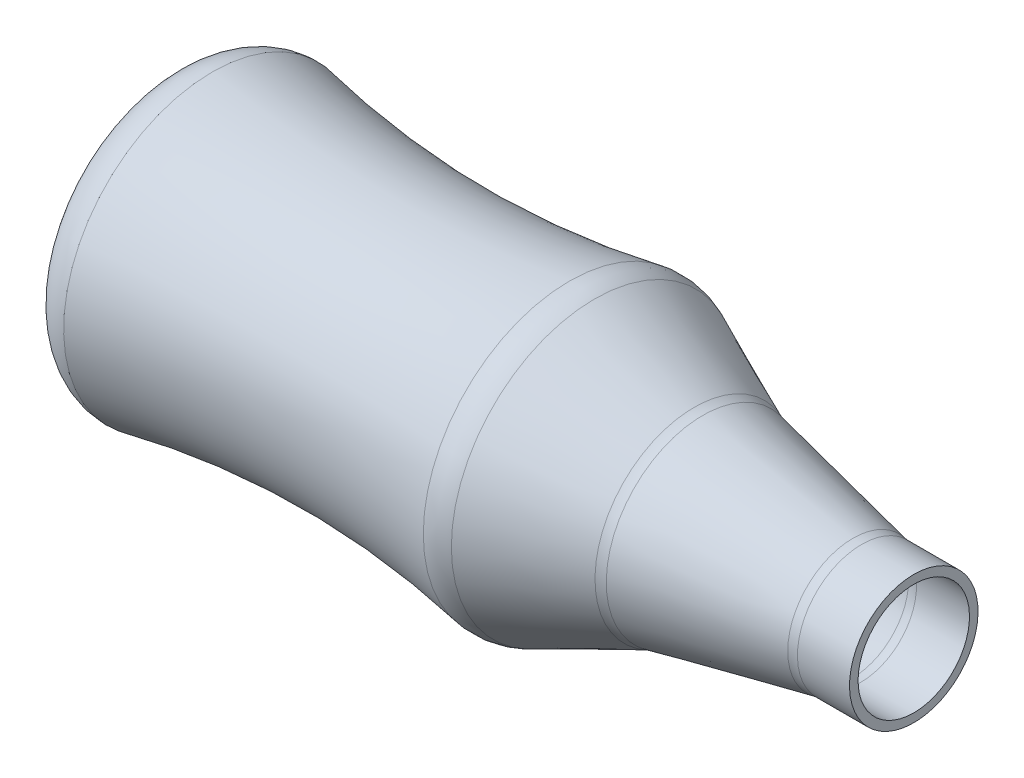
ISO-10303-21;
HEADER;
FILE_DESCRIPTION(('STEP AP214'),'2;1');
FILE_NAME('part.step','',(''),(''),'','','');
FILE_SCHEMA(('AUTOMOTIVE_DESIGN { 1 0 10303 214 1 1 1 1 }'));
ENDSEC;
DATA;
#1=APPLICATION_CONTEXT('core data for automotive mechanical design processes');
#2=APPLICATION_PROTOCOL_DEFINITION('international standard','automotive_design',2000,#1);
#3=PRODUCT_CONTEXT('',#1,'mechanical');
#4=PRODUCT('Part','Part','',(#3));
#5=PRODUCT_RELATED_PRODUCT_CATEGORY('part','',(#4));
#6=PRODUCT_DEFINITION_FORMATION('','',#4);
#7=PRODUCT_DEFINITION_CONTEXT('part definition',#1,'design');
#8=PRODUCT_DEFINITION('design','',#6,#7);
#9=PRODUCT_DEFINITION_SHAPE('','',#8);
#10=(LENGTH_UNIT() NAMED_UNIT(*) SI_UNIT(.MILLI.,.METRE.));
#11=(NAMED_UNIT(*) PLANE_ANGLE_UNIT() SI_UNIT($,.RADIAN.));
#12=(NAMED_UNIT(*) SI_UNIT($,.STERADIAN.) SOLID_ANGLE_UNIT());
#13=UNCERTAINTY_MEASURE_WITH_UNIT(LENGTH_MEASURE(1.E-05),#10,'distance_accuracy_value','');
#14=(GEOMETRIC_REPRESENTATION_CONTEXT(3) GLOBAL_UNCERTAINTY_ASSIGNED_CONTEXT((#13)) GLOBAL_UNIT_ASSIGNED_CONTEXT((#10,
#11,#12)) REPRESENTATION_CONTEXT('',''));
#15=CARTESIAN_POINT('',(0.,0.,0.));
#16=DIRECTION('',(0.,0.,1.));
#17=DIRECTION('',(1.,0.,0.));
#18=AXIS2_PLACEMENT_3D('',#15,#16,#17);
#19=CARTESIAN_POINT('',(0.,0.,0.));
#20=DIRECTION('',(-1.,0.,0.));
#21=DIRECTION('',(0.,-1.,0.));
#22=AXIS2_PLACEMENT_3D('',#19,#20,#21);
#23=PLANE('',#22);
#24=CARTESIAN_POINT('',(0.,0.,0.));
#25=DIRECTION('',(-1.,0.,0.));
#26=DIRECTION('',(0.,-1.,0.));
#27=AXIS2_PLACEMENT_3D('',#24,#25,#26);
#28=CIRCLE('',#27,13.);
#29=CARTESIAN_POINT('',(0.,-13.,0.));
#30=VERTEX_POINT('',#29);
#31=EDGE_CURVE('E76',#30,#30,#28,.F.);
#32=ORIENTED_EDGE('',*,*,#31,.F.);
#33=EDGE_LOOP('',(#32));
#34=FACE_BOUND('',#33,.T.);
#35=CARTESIAN_POINT('',(0.,0.,0.));
#36=DIRECTION('',(1.,0.,0.));
#37=DIRECTION('',(0.,1.,0.));
#38=AXIS2_PLACEMENT_3D('',#35,#36,#37);
#39=CIRCLE('',#38,15.);
#40=CARTESIAN_POINT('',(0.,15.,0.));
#41=VERTEX_POINT('',#40);
#42=EDGE_CURVE('E67',#41,#41,#39,.T.);
#43=ORIENTED_EDGE('',*,*,#42,.T.);
#44=EDGE_LOOP('',(#43));
#45=FACE_BOUND('',#44,.T.);
#46=ADVANCED_FACE('F35',(#34,#45),#23,.F.);
#47=CARTESIAN_POINT('',(0.,0.,0.));
#48=DIRECTION('',(1.,0.,0.));
#49=DIRECTION('',(0.,1.,0.));
#50=AXIS2_PLACEMENT_3D('',#47,#48,#49);
#51=CYLINDRICAL_SURFACE('',#50,15.);
#52=CARTESIAN_POINT('',(-12.1564053171412,0.,0.));
#53=DIRECTION('',(1.,0.,0.));
#54=DIRECTION('',(0.,1.,0.));
#55=AXIS2_PLACEMENT_3D('',#52,#53,#54);
#56=CIRCLE('',#55,15.);
#57=CARTESIAN_POINT('',(-12.1564053171412,15.,0.));
#58=VERTEX_POINT('',#57);
#59=EDGE_CURVE('E50',#58,#58,#56,.T.);
#60=ORIENTED_EDGE('',*,*,#59,.T.);
#61=EDGE_LOOP('',(#60));
#62=FACE_BOUND('',#61,.T.);
#63=ORIENTED_EDGE('',*,*,#42,.F.);
#64=EDGE_LOOP('',(#63));
#65=FACE_BOUND('',#64,.T.);
#66=ADVANCED_FACE('F111',(#62,#65),#51,.T.);
#67=CARTESIAN_POINT('',(-50.28,0.,0.));
#68=DIRECTION('',(-1.,0.,0.));
#69=DIRECTION('',(0.,-1.,0.));
#70=AXIS2_PLACEMENT_3D('',#67,#68,#69);
#71=CONICAL_SURFACE('',#70,22.75,0.205987480927103);
#72=CARTESIAN_POINT('',(-49.2503154175611,0.,0.));
#73=DIRECTION('',(-1.,0.,0.));
#74=DIRECTION('',(0.,-1.,0.));
#75=AXIS2_PLACEMENT_3D('',#72,#73,#74);
#76=CIRCLE('',#75,22.5348461711);
#77=CARTESIAN_POINT('',(-49.2503154175611,-22.5348461711,0.));
#78=VERTEX_POINT('',#77);
#79=EDGE_CURVE('E61',#78,#78,#76,.F.);
#80=ORIENTED_EDGE('',*,*,#79,.T.);
#81=EDGE_LOOP('',(#80));
#82=FACE_BOUND('',#81,.T.);
#83=CARTESIAN_POINT('',(-14.2017439625941,0.,0.));
#84=DIRECTION('',(-1.,0.,0.));
#85=DIRECTION('',(0.,-1.,0.));
#86=AXIS2_PLACEMENT_3D('',#83,#84,#85);
#87=CIRCLE('',#86,15.2114051148586);
#88=CARTESIAN_POINT('',(-14.2017439625941,-15.2114051148586,0.));
#89=VERTEX_POINT('',#88);
#90=EDGE_CURVE('E64',#89,#89,#87,.T.);
#91=ORIENTED_EDGE('',*,*,#90,.T.);
#92=EDGE_LOOP('',(#91));
#93=FACE_BOUND('',#92,.T.);
#94=ADVANCED_FACE('F117',(#82,#93),#71,.T.);
#95=CARTESIAN_POINT('',(-77.37,0.,0.));
#96=DIRECTION('',(-1.,0.,0.));
#97=DIRECTION('',(0.,-1.,0.));
#98=AXIS2_PLACEMENT_3D('',#95,#96,#97);
#99=CONICAL_SURFACE('',#98,34.705,0.41560114868109);
#100=CARTESIAN_POINT('',(-51.242376556801,0.,0.));
#101=DIRECTION('',(-1.,0.,0.));
#102=DIRECTION('',(0.,-1.,0.));
#103=AXIS2_PLACEMENT_3D('',#100,#101,#102);
#104=CIRCLE('',#103,23.1747032756204);
#105=CARTESIAN_POINT('',(-51.242376556801,-23.1747032756204,0.));
#106=VERTEX_POINT('',#105);
#107=EDGE_CURVE('E55',#106,#106,#104,.T.);
#108=ORIENTED_EDGE('',*,*,#107,.T.);
#109=EDGE_LOOP('',(#108));
#110=FACE_BOUND('',#109,.T.);
#111=CARTESIAN_POINT('',(-74.5089876487827,0.,0.));
#112=DIRECTION('',(1.,0.,0.));
#113=DIRECTION('',(0.,1.,0.));
#114=AXIS2_PLACEMENT_3D('',#111,#112,#113);
#115=CIRCLE('',#114,33.4424159225248);
#116=CARTESIAN_POINT('',(-74.5089876487827,33.4424159225248,0.));
#117=VERTEX_POINT('',#116);
#118=EDGE_CURVE('E58',#117,#117,#115,.T.);
#119=ORIENTED_EDGE('',*,*,#118,.T.);
#120=EDGE_LOOP('',(#119));
#121=FACE_BOUND('',#120,.T.);
#122=ADVANCED_FACE('F137',(#110,#121),#99,.T.);
#123=CARTESIAN_POINT('',(-120.56,0.,0.));
#124=DIRECTION('',(1.,0.,0.));
#125=DIRECTION('',(0.,1.,0.));
#126=AXIS2_PLACEMENT_3D('',#123,#124,#125);
#127=TOROIDAL_SURFACE('',#126,250.423853835264,220.);
#128=CARTESIAN_POINT('',(-80.3730662407156,0.,0.));
#129=DIRECTION('',(-1.,0.,0.));
#130=DIRECTION('',(0.,-1.,0.));
#131=AXIS2_PLACEMENT_3D('',#128,#129,#130);
#132=CIRCLE('',#131,34.1254249111803);
#133=CARTESIAN_POINT('',(-80.3730662407156,-34.1254249111803,0.));
#134=VERTEX_POINT('',#133);
#135=EDGE_CURVE('E46',#134,#134,#132,.T.);
#136=ORIENTED_EDGE('',*,*,#135,.T.);
#137=EDGE_LOOP('',(#136));
#138=FACE_BOUND('',#137,.T.);
#139=CARTESIAN_POINT('',(-163.75,0.,0.));
#140=DIRECTION('',(1.,0.,0.));
#141=DIRECTION('',(0.,1.,0.));
#142=AXIS2_PLACEMENT_3D('',#139,#140,#141);
#143=CIRCLE('',#142,34.705);
#144=CARTESIAN_POINT('',(-163.75,34.705,0.));
#145=VERTEX_POINT('',#144);
#146=EDGE_CURVE('E70',#145,#145,#143,.T.);
#147=ORIENTED_EDGE('',*,*,#146,.T.);
#148=EDGE_LOOP('',(#147));
#149=FACE_BOUND('',#148,.T.);
#150=ADVANCED_FACE('F139',(#138,#149),#127,.F.);
#151=CARTESIAN_POINT('',(-163.75,0.,0.));
#152=DIRECTION('',(1.,0.,0.));
#153=DIRECTION('',(0.,1.,0.));
#154=AXIS2_PLACEMENT_3D('',#151,#152,#153);
#155=TOROIDAL_SURFACE('',#154,24.705,10.);
#156=ORIENTED_EDGE('',*,*,#146,.F.);
#157=EDGE_LOOP('',(#156));
#158=FACE_BOUND('',#157,.T.);
#159=CARTESIAN_POINT('',(-173.75,0.,0.));
#160=DIRECTION('',(1.,0.,0.));
#161=DIRECTION('',(0.,0.,-1.));
#162=AXIS2_PLACEMENT_3D('',#159,#160,#161);
#163=CIRCLE('',#162,24.705);
#164=CARTESIAN_POINT('',(-173.75,0.,-24.705));
#165=VERTEX_POINT('',#164);
#166=EDGE_CURVE('E84',#165,#165,#163,.T.);
#167=ORIENTED_EDGE('',*,*,#166,.T.);
#168=EDGE_LOOP('',(#167));
#169=FACE_BOUND('',#168,.T.);
#170=ADVANCED_FACE('F92',(#158,#169),#155,.T.);
#171=CARTESIAN_POINT('',(0.,0.,0.));
#172=DIRECTION('',(1.,0.,0.));
#173=DIRECTION('',(0.,1.,0.));
#174=AXIS2_PLACEMENT_3D('',#171,#172,#173);
#175=CYLINDRICAL_SURFACE('',#174,13.);
#176=CARTESIAN_POINT('',(-12.363124253713,0.,0.));
#177=DIRECTION('',(-1.,0.,0.));
#178=DIRECTION('',(0.,-1.,0.));
#179=AXIS2_PLACEMENT_3D('',#176,#177,#178);
#180=CIRCLE('',#179,13.);
#181=CARTESIAN_POINT('',(-12.363124253713,-13.,0.));
#182=VERTEX_POINT('',#181);
#183=EDGE_CURVE('E10',#182,#182,#180,.T.);
#184=ORIENTED_EDGE('',*,*,#183,.T.);
#185=EDGE_LOOP('',(#184));
#186=FACE_BOUND('',#185,.T.);
#187=ORIENTED_EDGE('',*,*,#31,.T.);
#188=EDGE_LOOP('',(#187));
#189=FACE_BOUND('',#188,.T.);
#190=ADVANCED_FACE('F152',(#186,#189),#175,.F.);
#191=CARTESIAN_POINT('',(-50.6890677290906,0.,0.));
#192=DIRECTION('',(-1.,0.,0.));
#193=DIRECTION('',(0.,-1.,0.));
#194=AXIS2_PLACEMENT_3D('',#191,#192,#193);
#195=CONICAL_SURFACE('',#194,20.7922810229717,0.205987480927103);
#196=CARTESIAN_POINT('',(-14.4084628991658,0.,0.));
#197=DIRECTION('',(1.,0.,0.));
#198=DIRECTION('',(0.,1.,0.));
#199=AXIS2_PLACEMENT_3D('',#196,#197,#198);
#200=CIRCLE('',#199,13.2114051148586);
#201=CARTESIAN_POINT('',(-14.4084628991658,13.2114051148586,0.));
#202=VERTEX_POINT('',#201);
#203=EDGE_CURVE('E42',#202,#202,#200,.T.);
#204=ORIENTED_EDGE('',*,*,#203,.T.);
#205=EDGE_LOOP('',(#204));
#206=FACE_BOUND('',#205,.T.);
#207=CARTESIAN_POINT('',(-50.8950046455784,0.,0.));
#208=DIRECTION('',(1.,0.,0.));
#209=DIRECTION('',(0.,1.,0.));
#210=AXIS2_PLACEMENT_3D('',#207,#208,#209);
#211=CIRCLE('',#210,20.8353117887517);
#212=CARTESIAN_POINT('',(-50.8950046455784,20.8353117887517,0.));
#213=VERTEX_POINT('',#212);
#214=EDGE_CURVE('E79',#213,#213,#211,.T.);
#215=ORIENTED_EDGE('',*,*,#214,.F.);
#216=EDGE_LOOP('',(#215));
#217=FACE_BOUND('',#216,.T.);
#218=ADVANCED_FACE('F164',(#206,#217),#195,.F.);
#219=CARTESIAN_POINT('',(-78.1774799569386,0.,0.));
#220=DIRECTION('',(-1.,0.,0.));
#221=DIRECTION('',(0.,-1.,0.));
#222=AXIS2_PLACEMENT_3D('',#219,#220,#221);
#223=CONICAL_SURFACE('',#222,32.8752524438758,0.41560114868109);
#224=ORIENTED_EDGE('',*,*,#214,.T.);
#225=EDGE_LOOP('',(#224));
#226=FACE_BOUND('',#225,.T.);
#227=CARTESIAN_POINT('',(-77.5996520345166,0.,0.));
#228=DIRECTION('',(-1.,0.,0.));
#229=DIRECTION('',(0.,-1.,0.));
#230=AXIS2_PLACEMENT_3D('',#227,#228,#229);
#231=CIRCLE('',#230,32.620253078333);
#232=CARTESIAN_POINT('',(-77.5996520345166,-32.620253078333,0.));
#233=VERTEX_POINT('',#232);
#234=EDGE_CURVE('E83',#233,#233,#231,.F.);
#235=ORIENTED_EDGE('',*,*,#234,.F.);
#236=EDGE_LOOP('',(#235));
#237=FACE_BOUND('',#236,.T.);
#238=ADVANCED_FACE('F160',(#226,#237),#223,.F.);
#239=CARTESIAN_POINT('',(-120.56,0.,0.));
#240=DIRECTION('',(1.,0.,0.));
#241=DIRECTION('',(0.,1.,0.));
#242=AXIS2_PLACEMENT_3D('',#239,#240,#241);
#243=TOROIDAL_SURFACE('',#242,250.423853835264,222.);
#244=ORIENTED_EDGE('',*,*,#234,.T.);
#245=EDGE_LOOP('',(#244));
#246=FACE_BOUND('',#245,.T.);
#247=CARTESIAN_POINT('',(-163.936842614778,0.,0.));
#248=DIRECTION('',(-1.,0.,0.));
#249=DIRECTION('',(0.,-1.,0.));
#250=AXIS2_PLACEMENT_3D('',#247,#248,#249);
#251=CIRCLE('',#250,32.7028178172145);
#252=CARTESIAN_POINT('',(-163.936842614778,-32.7028178172145,0.));
#253=VERTEX_POINT('',#252);
#254=EDGE_CURVE('E80',#253,#253,#251,.F.);
#255=ORIENTED_EDGE('',*,*,#254,.F.);
#256=EDGE_LOOP('',(#255));
#257=FACE_BOUND('',#256,.T.);
#258=ADVANCED_FACE('F156',(#246,#257),#243,.T.);
#259=CARTESIAN_POINT('',(-163.75,0.,0.));
#260=DIRECTION('',(1.,0.,0.));
#261=DIRECTION('',(0.,1.,0.));
#262=AXIS2_PLACEMENT_3D('',#259,#260,#261);
#263=TOROIDAL_SURFACE('',#262,24.705,8.00000000000001);
#264=ORIENTED_EDGE('',*,*,#254,.T.);
#265=EDGE_LOOP('',(#264));
#266=FACE_BOUND('',#265,.T.);
#267=CARTESIAN_POINT('',(-171.75,0.,0.));
#268=DIRECTION('',(1.,0.,0.));
#269=DIRECTION('',(0.,1.,0.));
#270=AXIS2_PLACEMENT_3D('',#267,#268,#269);
#271=CIRCLE('',#270,24.705);
#272=CARTESIAN_POINT('',(-171.75,24.705,0.));
#273=VERTEX_POINT('',#272);
#274=EDGE_CURVE('E73',#273,#273,#271,.T.);
#275=ORIENTED_EDGE('',*,*,#274,.F.);
#276=EDGE_LOOP('',(#275));
#277=FACE_BOUND('',#276,.T.);
#278=ADVANCED_FACE('F106',(#266,#277),#263,.F.);
#279=CARTESIAN_POINT('',(-171.75,0.,0.));
#280=DIRECTION('',(1.,0.,0.));
#281=DIRECTION('',(0.,0.,-1.));
#282=AXIS2_PLACEMENT_3D('',#279,#280,#281);
#283=PLANE('',#282);
#284=ORIENTED_EDGE('',*,*,#274,.T.);
#285=EDGE_LOOP('',(#284));
#286=FACE_BOUND('',#285,.T.);
#287=ADVANCED_FACE('F97',(#286),#283,.T.);
#288=CARTESIAN_POINT('',(-173.75,0.,0.));
#289=DIRECTION('',(1.,0.,0.));
#290=DIRECTION('',(0.,0.,-1.));
#291=AXIS2_PLACEMENT_3D('',#288,#289,#290);
#292=PLANE('',#291);
#293=ORIENTED_EDGE('',*,*,#166,.F.);
#294=EDGE_LOOP('',(#293));
#295=FACE_BOUND('',#294,.T.);
#296=ADVANCED_FACE('F94',(#295),#292,.F.);
#297=CARTESIAN_POINT('',(-47.2049767721083,0.,0.));
#298=DIRECTION('',(1.,0.,0.));
#299=DIRECTION('',(0.,1.,0.));
#300=AXIS2_PLACEMENT_3D('',#297,#298,#299);
#301=TOROIDAL_SURFACE('',#300,32.3234410562414,10.);
#302=ORIENTED_EDGE('',*,*,#107,.F.);
#303=EDGE_LOOP('',(#302));
#304=FACE_BOUND('',#303,.T.);
#305=ORIENTED_EDGE('',*,*,#79,.F.);
#306=EDGE_LOOP('',(#305));
#307=FACE_BOUND('',#306,.T.);
#308=ADVANCED_FACE('F96',(#304,#307),#301,.F.);
#309=CARTESIAN_POINT('',(-12.1564053171412,0.,0.));
#310=DIRECTION('',(1.,0.,0.));
#311=DIRECTION('',(0.,1.,0.));
#312=AXIS2_PLACEMENT_3D('',#309,#310,#311);
#313=TOROIDAL_SURFACE('',#312,25.,10.);
#314=ORIENTED_EDGE('',*,*,#90,.F.);
#315=EDGE_LOOP('',(#314));
#316=FACE_BOUND('',#315,.T.);
#317=ORIENTED_EDGE('',*,*,#59,.F.);
#318=EDGE_LOOP('',(#317));
#319=FACE_BOUND('',#318,.T.);
#320=ADVANCED_FACE('F103',(#316,#319),#313,.F.);
#321=CARTESIAN_POINT('',(-78.5463874334754,0.,0.));
#322=DIRECTION('',(-1.,0.,0.));
#323=DIRECTION('',(0.,-1.,0.));
#324=AXIS2_PLACEMENT_3D('',#321,#322,#323);
#325=TOROIDAL_SURFACE('',#324,24.2936781419037,10.);
#326=ORIENTED_EDGE('',*,*,#135,.F.);
#327=EDGE_LOOP('',(#326));
#328=FACE_BOUND('',#327,.T.);
#329=ORIENTED_EDGE('',*,*,#118,.F.);
#330=EDGE_LOOP('',(#329));
#331=FACE_BOUND('',#330,.T.);
#332=ADVANCED_FACE('F125',(#328,#331),#325,.T.);
#333=CARTESIAN_POINT('',(-12.363124253713,0.,0.));
#334=DIRECTION('',(-1.,0.,0.));
#335=DIRECTION('',(0.,-1.,0.));
#336=AXIS2_PLACEMENT_3D('',#333,#334,#335);
#337=TOROIDAL_SURFACE('',#336,23.,10.);
#338=ORIENTED_EDGE('',*,*,#183,.F.);
#339=EDGE_LOOP('',(#338));
#340=FACE_BOUND('',#339,.T.);
#341=ORIENTED_EDGE('',*,*,#203,.F.);
#342=EDGE_LOOP('',(#341));
#343=FACE_BOUND('',#342,.T.);
#344=ADVANCED_FACE('F37',(#340,#343),#337,.T.);
#345=CLOSED_SHELL('',(#46,#66,#94,#122,#150,#170,#190,#218,#238,#258,#278,#287,#296,#308,#320,
#332,#344));
#346=MANIFOLD_SOLID_BREP('B2',#345);
#347=ADVANCED_BREP_SHAPE_REPRESENTATION('',(#18,#346),#14);
#348=SHAPE_DEFINITION_REPRESENTATION(#9,#347);
ENDSEC;
END-ISO-10303-21;
